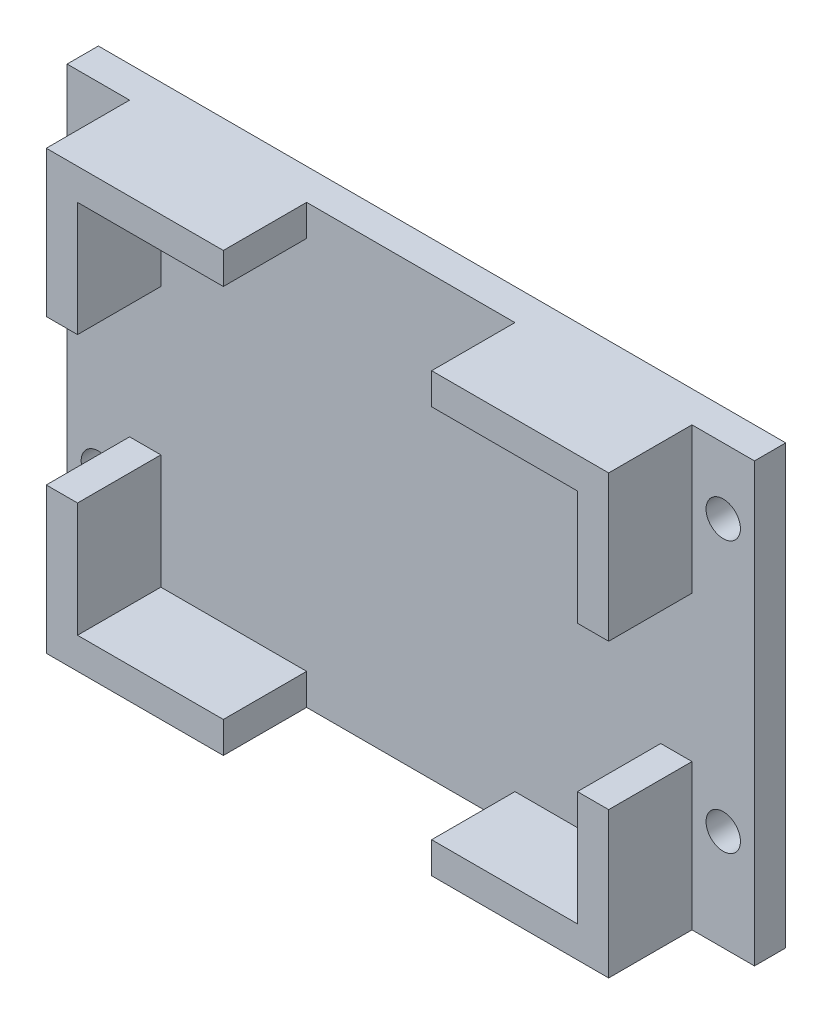
ISO-10303-21;
HEADER;
FILE_DESCRIPTION(('STEP AP214'),'2;1');
FILE_NAME('part.step','',(''),(''),'','','');
FILE_SCHEMA(('AUTOMOTIVE_DESIGN { 1 0 10303 214 1 1 1 1 }'));
ENDSEC;
DATA;
#1=APPLICATION_CONTEXT('core data for automotive mechanical design processes');
#2=APPLICATION_PROTOCOL_DEFINITION('international standard','automotive_design',2000,#1);
#3=PRODUCT_CONTEXT('',#1,'mechanical');
#4=PRODUCT('Part','Part','',(#3));
#5=PRODUCT_RELATED_PRODUCT_CATEGORY('part','',(#4));
#6=PRODUCT_DEFINITION_FORMATION('','',#4);
#7=PRODUCT_DEFINITION_CONTEXT('part definition',#1,'design');
#8=PRODUCT_DEFINITION('design','',#6,#7);
#9=PRODUCT_DEFINITION_SHAPE('','',#8);
#10=(LENGTH_UNIT() NAMED_UNIT(*) SI_UNIT(.MILLI.,.METRE.));
#11=(NAMED_UNIT(*) PLANE_ANGLE_UNIT() SI_UNIT($,.RADIAN.));
#12=(NAMED_UNIT(*) SI_UNIT($,.STERADIAN.) SOLID_ANGLE_UNIT());
#13=UNCERTAINTY_MEASURE_WITH_UNIT(LENGTH_MEASURE(1.E-05),#10,'distance_accuracy_value','');
#14=(GEOMETRIC_REPRESENTATION_CONTEXT(3) GLOBAL_UNCERTAINTY_ASSIGNED_CONTEXT((#13)) GLOBAL_UNIT_ASSIGNED_CONTEXT((#10,
#11,#12)) REPRESENTATION_CONTEXT('',''));
#15=CARTESIAN_POINT('',(0.,0.,0.));
#16=DIRECTION('',(0.,0.,1.));
#17=DIRECTION('',(1.,0.,0.));
#18=AXIS2_PLACEMENT_3D('',#15,#16,#17);
#19=CARTESIAN_POINT('',(0.,0.,11.));
#20=DIRECTION('',(0.,0.,1.));
#21=DIRECTION('',(1.,0.,0.));
#22=AXIS2_PLACEMENT_3D('',#19,#20,#21);
#23=PLANE('',#22);
#24=DIRECTION('',(-1.,0.,0.));
#25=VECTOR('',#24,1.);
#26=CARTESIAN_POINT('',(33.,-6.99999999999999,11.));
#27=LINE('',#26,#25);
#28=CARTESIAN_POINT('',(-24.,-7.,11.));
#29=VERTEX_POINT('',#28);
#30=CARTESIAN_POINT('',(-27.,-7.,11.));
#31=VERTEX_POINT('',#30);
#32=EDGE_CURVE('E598',#29,#31,#27,.T.);
#33=ORIENTED_EDGE('',*,*,#32,.T.);
#34=DIRECTION('',(0.,-1.,0.));
#35=VECTOR('',#34,1.);
#36=CARTESIAN_POINT('',(-27.,21.,11.));
#37=LINE('',#36,#35);
#38=CARTESIAN_POINT('',(-27.,-21.,11.));
#39=VERTEX_POINT('',#38);
#40=EDGE_CURVE('E243',#31,#39,#37,.T.);
#41=ORIENTED_EDGE('',*,*,#40,.T.);
#42=DIRECTION('',(1.,0.,0.));
#43=VECTOR('',#42,1.);
#44=CARTESIAN_POINT('',(-27.,-21.,11.));
#45=LINE('',#44,#43);
#46=CARTESIAN_POINT('',(-10.,-21.,11.));
#47=VERTEX_POINT('',#46);
#48=EDGE_CURVE('E245',#39,#47,#45,.T.);
#49=ORIENTED_EDGE('',*,*,#48,.T.);
#50=DIRECTION('',(0.,1.,0.));
#51=VECTOR('',#50,1.);
#52=CARTESIAN_POINT('',(-10.,-119.75,11.));
#53=LINE('',#52,#51);
#54=CARTESIAN_POINT('',(-10.,-18.,11.));
#55=VERTEX_POINT('',#54);
#56=EDGE_CURVE('E449',#47,#55,#53,.T.);
#57=ORIENTED_EDGE('',*,*,#56,.T.);
#58=DIRECTION('',(1.,0.,0.));
#59=VECTOR('',#58,1.);
#60=CARTESIAN_POINT('',(-24.,-18.,11.));
#61=LINE('',#60,#59);
#62=CARTESIAN_POINT('',(-24.,-18.,11.));
#63=VERTEX_POINT('',#62);
#64=EDGE_CURVE('E339',#63,#55,#61,.T.);
#65=ORIENTED_EDGE('',*,*,#64,.F.);
#66=DIRECTION('',(0.,-1.,0.));
#67=VECTOR('',#66,1.);
#68=CARTESIAN_POINT('',(-24.,18.,11.));
#69=LINE('',#68,#67);
#70=EDGE_CURVE('E473',#29,#63,#69,.T.);
#71=ORIENTED_EDGE('',*,*,#70,.F.);
#72=EDGE_LOOP('',(#33,#41,#49,#57,#65,#71));
#73=FACE_BOUND('',#72,.T.);
#74=ADVANCED_FACE('F36',(#73),#23,.T.);
#75=CARTESIAN_POINT('',(27.,-7.,11.));
#76=VERTEX_POINT('',#75);
#77=CARTESIAN_POINT('',(24.,-7.,11.));
#78=VERTEX_POINT('',#77);
#79=EDGE_CURVE('E427',#76,#78,#27,.T.);
#80=ORIENTED_EDGE('',*,*,#79,.T.);
#81=DIRECTION('',(0.,1.,0.));
#82=VECTOR('',#81,1.);
#83=CARTESIAN_POINT('',(24.,18.,11.));
#84=LINE('',#83,#82);
#85=CARTESIAN_POINT('',(24.,-18.,11.));
#86=VERTEX_POINT('',#85);
#87=EDGE_CURVE('E355',#86,#78,#84,.T.);
#88=ORIENTED_EDGE('',*,*,#87,.F.);
#89=CARTESIAN_POINT('',(10.,-18.,11.));
#90=VERTEX_POINT('',#89);
#91=EDGE_CURVE('E476',#90,#86,#61,.T.);
#92=ORIENTED_EDGE('',*,*,#91,.F.);
#93=DIRECTION('',(0.,1.,0.));
#94=VECTOR('',#93,1.);
#95=CARTESIAN_POINT('',(10.,-119.75,11.));
#96=LINE('',#95,#94);
#97=CARTESIAN_POINT('',(10.,-21.,11.));
#98=VERTEX_POINT('',#97);
#99=EDGE_CURVE('E440',#98,#90,#96,.T.);
#100=ORIENTED_EDGE('',*,*,#99,.F.);
#101=CARTESIAN_POINT('',(27.,-21.,11.));
#102=VERTEX_POINT('',#101);
#103=EDGE_CURVE('E242',#98,#102,#45,.T.);
#104=ORIENTED_EDGE('',*,*,#103,.T.);
#105=DIRECTION('',(0.,1.,0.));
#106=VECTOR('',#105,1.);
#107=CARTESIAN_POINT('',(27.,21.,11.));
#108=LINE('',#107,#106);
#109=EDGE_CURVE('E371',#102,#76,#108,.T.);
#110=ORIENTED_EDGE('',*,*,#109,.T.);
#111=EDGE_LOOP('',(#80,#88,#92,#100,#104,#110));
#112=FACE_BOUND('',#111,.T.);
#113=ADVANCED_FACE('F507',(#112),#23,.T.);
#114=CARTESIAN_POINT('',(27.,21.,11.));
#115=DIRECTION('',(-1.,0.,0.));
#116=DIRECTION('',(0.,-1.,0.));
#117=AXIS2_PLACEMENT_3D('',#114,#115,#116);
#118=PLANE('',#117);
#119=DIRECTION('',(0.,1.,0.));
#120=VECTOR('',#119,1.);
#121=CARTESIAN_POINT('',(27.,21.,3.));
#122=LINE('',#121,#120);
#123=CARTESIAN_POINT('',(27.,-21.,3.));
#124=VERTEX_POINT('',#123);
#125=CARTESIAN_POINT('',(27.,-6.99999999999999,3.));
#126=VERTEX_POINT('',#125);
#127=EDGE_CURVE('E253',#124,#126,#122,.T.);
#128=ORIENTED_EDGE('',*,*,#127,.T.);
#129=DIRECTION('',(0.,0.,1.));
#130=VECTOR('',#129,1.);
#131=CARTESIAN_POINT('',(27.,-6.99999999999999,11.));
#132=LINE('',#131,#130);
#133=EDGE_CURVE('E434',#126,#76,#132,.T.);
#134=ORIENTED_EDGE('',*,*,#133,.T.);
#135=ORIENTED_EDGE('',*,*,#109,.F.);
#136=DIRECTION('',(0.,0.,-1.));
#137=VECTOR('',#136,1.);
#138=CARTESIAN_POINT('',(27.,-21.,11.));
#139=LINE('',#138,#137);
#140=EDGE_CURVE('E252',#102,#124,#139,.T.);
#141=ORIENTED_EDGE('',*,*,#140,.T.);
#142=EDGE_LOOP('',(#128,#134,#135,#141));
#143=FACE_BOUND('',#142,.T.);
#144=ADVANCED_FACE('F513',(#143),#118,.F.);
#145=CARTESIAN_POINT('',(-27.,21.,11.));
#146=DIRECTION('',(1.,0.,0.));
#147=DIRECTION('',(0.,1.,0.));
#148=AXIS2_PLACEMENT_3D('',#145,#146,#147);
#149=PLANE('',#148);
#150=ORIENTED_EDGE('',*,*,#40,.F.);
#151=DIRECTION('',(0.,0.,1.));
#152=VECTOR('',#151,1.);
#153=CARTESIAN_POINT('',(-27.,-7.,3.));
#154=LINE('',#153,#152);
#155=CARTESIAN_POINT('',(-27.,-7.,3.));
#156=VERTEX_POINT('',#155);
#157=EDGE_CURVE('E228',#156,#31,#154,.T.);
#158=ORIENTED_EDGE('',*,*,#157,.F.);
#159=DIRECTION('',(0.,-1.,0.));
#160=VECTOR('',#159,1.);
#161=CARTESIAN_POINT('',(-27.,21.,3.));
#162=LINE('',#161,#160);
#163=CARTESIAN_POINT('',(-27.,-21.,3.));
#164=VERTEX_POINT('',#163);
#165=EDGE_CURVE('E256',#156,#164,#162,.T.);
#166=ORIENTED_EDGE('',*,*,#165,.T.);
#167=DIRECTION('',(0.,0.,-1.));
#168=VECTOR('',#167,1.);
#169=CARTESIAN_POINT('',(-27.,-21.,11.));
#170=LINE('',#169,#168);
#171=EDGE_CURVE('E262',#39,#164,#170,.T.);
#172=ORIENTED_EDGE('',*,*,#171,.F.);
#173=EDGE_LOOP('',(#150,#158,#166,#172));
#174=FACE_BOUND('',#173,.T.);
#175=ADVANCED_FACE('F578',(#174),#149,.F.);
#176=CARTESIAN_POINT('',(24.,18.,11.));
#177=DIRECTION('',(-1.,0.,0.));
#178=DIRECTION('',(0.,0.,1.));
#179=AXIS2_PLACEMENT_3D('',#176,#177,#178);
#180=PLANE('',#179);
#181=DIRECTION('',(0.,0.,1.));
#182=VECTOR('',#181,1.);
#183=CARTESIAN_POINT('',(24.,-6.99999999999999,11.));
#184=LINE('',#183,#182);
#185=CARTESIAN_POINT('',(24.,-7.,3.));
#186=VERTEX_POINT('',#185);
#187=EDGE_CURVE('E432',#186,#78,#184,.T.);
#188=ORIENTED_EDGE('',*,*,#187,.F.);
#189=DIRECTION('',(0.,1.,0.));
#190=VECTOR('',#189,1.);
#191=CARTESIAN_POINT('',(24.,18.,3.));
#192=LINE('',#191,#190);
#193=CARTESIAN_POINT('',(24.,-18.,3.));
#194=VERTEX_POINT('',#193);
#195=EDGE_CURVE('E478',#194,#186,#192,.T.);
#196=ORIENTED_EDGE('',*,*,#195,.F.);
#197=DIRECTION('',(0.,0.,-1.));
#198=VECTOR('',#197,1.);
#199=CARTESIAN_POINT('',(24.,-18.,11.));
#200=LINE('',#199,#198);
#201=EDGE_CURVE('E361',#86,#194,#200,.T.);
#202=ORIENTED_EDGE('',*,*,#201,.F.);
#203=ORIENTED_EDGE('',*,*,#87,.T.);
#204=EDGE_LOOP('',(#188,#196,#202,#203));
#205=FACE_BOUND('',#204,.T.);
#206=ADVANCED_FACE('F583',(#205),#180,.T.);
#207=CARTESIAN_POINT('',(-24.,18.,11.));
#208=DIRECTION('',(1.,0.,0.));
#209=DIRECTION('',(0.,0.,-1.));
#210=AXIS2_PLACEMENT_3D('',#207,#208,#209);
#211=PLANE('',#210);
#212=DIRECTION('',(0.,0.,-1.));
#213=VECTOR('',#212,1.);
#214=CARTESIAN_POINT('',(-24.,-7.,11.));
#215=LINE('',#214,#213);
#216=CARTESIAN_POINT('',(-24.,-7.,3.));
#217=VERTEX_POINT('',#216);
#218=EDGE_CURVE('E430',#29,#217,#215,.T.);
#219=ORIENTED_EDGE('',*,*,#218,.F.);
#220=ORIENTED_EDGE('',*,*,#70,.T.);
#221=DIRECTION('',(0.,0.,-1.));
#222=VECTOR('',#221,1.);
#223=CARTESIAN_POINT('',(-24.,-18.,11.));
#224=LINE('',#223,#222);
#225=CARTESIAN_POINT('',(-24.,-18.,3.));
#226=VERTEX_POINT('',#225);
#227=EDGE_CURVE('E364',#63,#226,#224,.T.);
#228=ORIENTED_EDGE('',*,*,#227,.T.);
#229=DIRECTION('',(0.,-1.,0.));
#230=VECTOR('',#229,1.);
#231=CARTESIAN_POINT('',(-24.,18.,3.));
#232=LINE('',#231,#230);
#233=EDGE_CURVE('E350',#217,#226,#232,.T.);
#234=ORIENTED_EDGE('',*,*,#233,.F.);
#235=EDGE_LOOP('',(#219,#220,#228,#234));
#236=FACE_BOUND('',#235,.T.);
#237=ADVANCED_FACE('F536',(#236),#211,.T.);
#238=CARTESIAN_POINT('',(0.,-21.,3.));
#239=DIRECTION('',(0.,-1.,0.));
#240=DIRECTION('',(0.,0.,-1.));
#241=AXIS2_PLACEMENT_3D('',#238,#239,#240);
#242=PLANE('',#241);
#243=DIRECTION('',(-1.,0.,0.));
#244=VECTOR('',#243,1.);
#245=CARTESIAN_POINT('',(0.,-21.,3.));
#246=LINE('',#245,#244);
#247=CARTESIAN_POINT('',(10.,-21.,3.));
#248=VERTEX_POINT('',#247);
#249=CARTESIAN_POINT('',(-10.,-21.,3.));
#250=VERTEX_POINT('',#249);
#251=EDGE_CURVE('E465',#248,#250,#246,.T.);
#252=ORIENTED_EDGE('',*,*,#251,.T.);
#253=DIRECTION('',(0.,0.,1.));
#254=VECTOR('',#253,1.);
#255=CARTESIAN_POINT('',(-10.,-21.,3.));
#256=LINE('',#255,#254);
#257=EDGE_CURVE('E462',#250,#47,#256,.T.);
#258=ORIENTED_EDGE('',*,*,#257,.T.);
#259=ORIENTED_EDGE('',*,*,#48,.F.);
#260=ORIENTED_EDGE('',*,*,#171,.T.);
#261=DIRECTION('',(-1.,0.,0.));
#262=VECTOR('',#261,1.);
#263=CARTESIAN_POINT('',(0.,-21.,3.));
#264=LINE('',#263,#262);
#265=CARTESIAN_POINT('',(-33.,-21.,3.));
#266=VERTEX_POINT('',#265);
#267=EDGE_CURVE('E278',#164,#266,#264,.T.);
#268=ORIENTED_EDGE('',*,*,#267,.T.);
#269=DIRECTION('',(0.,0.,-1.));
#270=VECTOR('',#269,1.);
#271=CARTESIAN_POINT('',(-33.,-21.,3.));
#272=LINE('',#271,#270);
#273=CARTESIAN_POINT('',(-33.,-21.,0.));
#274=VERTEX_POINT('',#273);
#275=EDGE_CURVE('E297',#266,#274,#272,.T.);
#276=ORIENTED_EDGE('',*,*,#275,.T.);
#277=DIRECTION('',(-1.,0.,0.));
#278=VECTOR('',#277,1.);
#279=CARTESIAN_POINT('',(0.,-21.,0.));
#280=LINE('',#279,#278);
#281=CARTESIAN_POINT('',(33.,-21.,0.));
#282=VERTEX_POINT('',#281);
#283=EDGE_CURVE('E303',#282,#274,#280,.T.);
#284=ORIENTED_EDGE('',*,*,#283,.F.);
#285=DIRECTION('',(0.,0.,-1.));
#286=VECTOR('',#285,1.);
#287=CARTESIAN_POINT('',(33.,-21.,3.));
#288=LINE('',#287,#286);
#289=CARTESIAN_POINT('',(33.,-21.,3.));
#290=VERTEX_POINT('',#289);
#291=EDGE_CURVE('E326',#290,#282,#288,.T.);
#292=ORIENTED_EDGE('',*,*,#291,.F.);
#293=EDGE_CURVE('E279',#290,#124,#264,.T.);
#294=ORIENTED_EDGE('',*,*,#293,.T.);
#295=ORIENTED_EDGE('',*,*,#140,.F.);
#296=ORIENTED_EDGE('',*,*,#103,.F.);
#297=DIRECTION('',(0.,0.,-1.));
#298=VECTOR('',#297,1.);
#299=CARTESIAN_POINT('',(10.,-21.,3.));
#300=LINE('',#299,#298);
#301=EDGE_CURVE('E454',#98,#248,#300,.T.);
#302=ORIENTED_EDGE('',*,*,#301,.T.);
#303=EDGE_LOOP('',(#252,#258,#259,#260,#268,#276,#284,#292,#294,#295,#296,#302));
#304=FACE_BOUND('',#303,.T.);
#305=ADVANCED_FACE('F410',(#304),#242,.T.);
#306=CARTESIAN_POINT('',(0.,21.,3.));
#307=DIRECTION('',(0.,-1.,0.));
#308=DIRECTION('',(0.,0.,-1.));
#309=AXIS2_PLACEMENT_3D('',#306,#307,#308);
#310=PLANE('',#309);
#311=DIRECTION('',(0.,0.,1.));
#312=VECTOR('',#311,1.);
#313=CARTESIAN_POINT('',(-10.,21.,3.));
#314=LINE('',#313,#312);
#315=CARTESIAN_POINT('',(-10.,21.,3.));
#316=VERTEX_POINT('',#315);
#317=CARTESIAN_POINT('',(-10.,21.,11.));
#318=VERTEX_POINT('',#317);
#319=EDGE_CURVE('E460',#316,#318,#314,.T.);
#320=ORIENTED_EDGE('',*,*,#319,.F.);
#321=DIRECTION('',(-1.,0.,0.));
#322=VECTOR('',#321,1.);
#323=CARTESIAN_POINT('',(0.,21.,3.));
#324=LINE('',#323,#322);
#325=CARTESIAN_POINT('',(10.,21.,3.));
#326=VERTEX_POINT('',#325);
#327=EDGE_CURVE('E11',#326,#316,#324,.T.);
#328=ORIENTED_EDGE('',*,*,#327,.F.);
#329=DIRECTION('',(0.,0.,-1.));
#330=VECTOR('',#329,1.);
#331=CARTESIAN_POINT('',(10.,21.,3.));
#332=LINE('',#331,#330);
#333=CARTESIAN_POINT('',(10.,21.,11.));
#334=VERTEX_POINT('',#333);
#335=EDGE_CURVE('E392',#334,#326,#332,.T.);
#336=ORIENTED_EDGE('',*,*,#335,.F.);
#337=DIRECTION('',(-1.,0.,0.));
#338=VECTOR('',#337,1.);
#339=CARTESIAN_POINT('',(-27.,21.,11.));
#340=LINE('',#339,#338);
#341=CARTESIAN_POINT('',(27.,21.,11.));
#342=VERTEX_POINT('',#341);
#343=EDGE_CURVE('E247',#342,#334,#340,.T.);
#344=ORIENTED_EDGE('',*,*,#343,.F.);
#345=DIRECTION('',(0.,0.,-1.));
#346=VECTOR('',#345,1.);
#347=CARTESIAN_POINT('',(27.,21.,11.));
#348=LINE('',#347,#346);
#349=CARTESIAN_POINT('',(27.,21.,3.));
#350=VERTEX_POINT('',#349);
#351=EDGE_CURVE('E267',#342,#350,#348,.T.);
#352=ORIENTED_EDGE('',*,*,#351,.T.);
#353=DIRECTION('',(-1.,0.,0.));
#354=VECTOR('',#353,1.);
#355=CARTESIAN_POINT('',(0.,21.,3.));
#356=LINE('',#355,#354);
#357=CARTESIAN_POINT('',(33.,21.,3.));
#358=VERTEX_POINT('',#357);
#359=EDGE_CURVE('E285',#358,#350,#356,.T.);
#360=ORIENTED_EDGE('',*,*,#359,.F.);
#361=DIRECTION('',(0.,0.,-1.));
#362=VECTOR('',#361,1.);
#363=CARTESIAN_POINT('',(33.,21.,3.));
#364=LINE('',#363,#362);
#365=CARTESIAN_POINT('',(33.,21.,0.));
#366=VERTEX_POINT('',#365);
#367=EDGE_CURVE('E324',#358,#366,#364,.T.);
#368=ORIENTED_EDGE('',*,*,#367,.T.);
#369=DIRECTION('',(-1.,0.,0.));
#370=VECTOR('',#369,1.);
#371=CARTESIAN_POINT('',(0.,21.,0.));
#372=LINE('',#371,#370);
#373=CARTESIAN_POINT('',(-33.,21.,0.));
#374=VERTEX_POINT('',#373);
#375=EDGE_CURVE('E309',#366,#374,#372,.T.);
#376=ORIENTED_EDGE('',*,*,#375,.T.);
#377=DIRECTION('',(0.,0.,-1.));
#378=VECTOR('',#377,1.);
#379=CARTESIAN_POINT('',(-33.,21.,3.));
#380=LINE('',#379,#378);
#381=CARTESIAN_POINT('',(-33.,21.,3.));
#382=VERTEX_POINT('',#381);
#383=EDGE_CURVE('E321',#382,#374,#380,.T.);
#384=ORIENTED_EDGE('',*,*,#383,.F.);
#385=CARTESIAN_POINT('',(-27.,21.,3.));
#386=VERTEX_POINT('',#385);
#387=EDGE_CURVE('E284',#386,#382,#356,.T.);
#388=ORIENTED_EDGE('',*,*,#387,.F.);
#389=DIRECTION('',(0.,0.,-1.));
#390=VECTOR('',#389,1.);
#391=CARTESIAN_POINT('',(-27.,21.,11.));
#392=LINE('',#391,#390);
#393=CARTESIAN_POINT('',(-27.,21.,11.));
#394=VERTEX_POINT('',#393);
#395=EDGE_CURVE('E265',#394,#386,#392,.T.);
#396=ORIENTED_EDGE('',*,*,#395,.F.);
#397=EDGE_CURVE('E240',#318,#394,#340,.T.);
#398=ORIENTED_EDGE('',*,*,#397,.F.);
#399=EDGE_LOOP('',(#320,#328,#336,#344,#352,#360,#368,#376,#384,#388,#396,#398));
#400=FACE_BOUND('',#399,.T.);
#401=ADVANCED_FACE('F389',(#400),#310,.F.);
#402=DIRECTION('',(-1.,0.,0.));
#403=VECTOR('',#402,1.);
#404=CARTESIAN_POINT('',(33.,7.00000000000001,11.));
#405=LINE('',#404,#403);
#406=CARTESIAN_POINT('',(-24.,7.,11.));
#407=VERTEX_POINT('',#406);
#408=CARTESIAN_POINT('',(-27.,7.,11.));
#409=VERTEX_POINT('',#408);
#410=EDGE_CURVE('E218',#407,#409,#405,.T.);
#411=ORIENTED_EDGE('',*,*,#410,.F.);
#412=CARTESIAN_POINT('',(-24.,18.,11.));
#413=VERTEX_POINT('',#412);
#414=EDGE_CURVE('E474',#413,#407,#69,.T.);
#415=ORIENTED_EDGE('',*,*,#414,.F.);
#416=DIRECTION('',(-1.,0.,0.));
#417=VECTOR('',#416,1.);
#418=CARTESIAN_POINT('',(-24.,18.,11.));
#419=LINE('',#418,#417);
#420=CARTESIAN_POINT('',(-10.,17.9999999999999,11.));
#421=VERTEX_POINT('',#420);
#422=EDGE_CURVE('E469',#421,#413,#419,.T.);
#423=ORIENTED_EDGE('',*,*,#422,.F.);
#424=EDGE_CURVE('E447',#421,#318,#53,.T.);
#425=ORIENTED_EDGE('',*,*,#424,.T.);
#426=ORIENTED_EDGE('',*,*,#397,.T.);
#427=EDGE_CURVE('E234',#394,#409,#37,.T.);
#428=ORIENTED_EDGE('',*,*,#427,.T.);
#429=EDGE_LOOP('',(#411,#415,#423,#425,#426,#428));
#430=FACE_BOUND('',#429,.T.);
#431=ADVANCED_FACE('F237',(#430),#23,.T.);
#432=CARTESIAN_POINT('',(-24.,18.,11.));
#433=DIRECTION('',(0.,-1.,0.));
#434=DIRECTION('',(0.,0.,-1.));
#435=AXIS2_PLACEMENT_3D('',#432,#433,#434);
#436=PLANE('',#435);
#437=DIRECTION('',(-1.,0.,0.));
#438=VECTOR('',#437,1.);
#439=CARTESIAN_POINT('',(-24.,18.,3.));
#440=LINE('',#439,#438);
#441=CARTESIAN_POINT('',(-10.,17.9999999999999,3.));
#442=VERTEX_POINT('',#441);
#443=CARTESIAN_POINT('',(-24.,18.,3.));
#444=VERTEX_POINT('',#443);
#445=EDGE_CURVE('E480',#442,#444,#440,.T.);
#446=ORIENTED_EDGE('',*,*,#445,.F.);
#447=DIRECTION('',(0.,0.,1.));
#448=VECTOR('',#447,1.);
#449=CARTESIAN_POINT('',(-10.,18.,11.));
#450=LINE('',#449,#448);
#451=EDGE_CURVE('E457',#442,#421,#450,.T.);
#452=ORIENTED_EDGE('',*,*,#451,.T.);
#453=ORIENTED_EDGE('',*,*,#422,.T.);
#454=DIRECTION('',(0.,0.,-1.));
#455=VECTOR('',#454,1.);
#456=CARTESIAN_POINT('',(-24.,18.,11.));
#457=LINE('',#456,#455);
#458=EDGE_CURVE('E366',#413,#444,#457,.T.);
#459=ORIENTED_EDGE('',*,*,#458,.T.);
#460=EDGE_LOOP('',(#446,#452,#453,#459));
#461=FACE_BOUND('',#460,.T.);
#462=ADVANCED_FACE('F488',(#461),#436,.T.);
#463=CARTESIAN_POINT('',(24.,18.,11.));
#464=VERTEX_POINT('',#463);
#465=CARTESIAN_POINT('',(10.,17.9999999999999,11.));
#466=VERTEX_POINT('',#465);
#467=EDGE_CURVE('E470',#464,#466,#419,.T.);
#468=ORIENTED_EDGE('',*,*,#467,.T.);
#469=DIRECTION('',(0.,0.,-1.));
#470=VECTOR('',#469,1.);
#471=CARTESIAN_POINT('',(10.,18.,11.));
#472=LINE('',#471,#470);
#473=CARTESIAN_POINT('',(10.,18.,3.));
#474=VERTEX_POINT('',#473);
#475=EDGE_CURVE('E450',#466,#474,#472,.T.);
#476=ORIENTED_EDGE('',*,*,#475,.T.);
#477=CARTESIAN_POINT('',(24.,18.,3.));
#478=VERTEX_POINT('',#477);
#479=EDGE_CURVE('E481',#478,#474,#440,.T.);
#480=ORIENTED_EDGE('',*,*,#479,.F.);
#481=DIRECTION('',(0.,0.,-1.));
#482=VECTOR('',#481,1.);
#483=CARTESIAN_POINT('',(24.,18.,11.));
#484=LINE('',#483,#482);
#485=EDGE_CURVE('E369',#464,#478,#484,.T.);
#486=ORIENTED_EDGE('',*,*,#485,.F.);
#487=EDGE_LOOP('',(#468,#476,#480,#486));
#488=FACE_BOUND('',#487,.T.);
#489=ADVANCED_FACE('F530',(#488),#436,.T.);
#490=CARTESIAN_POINT('',(-24.,-18.,11.));
#491=DIRECTION('',(0.,1.,0.));
#492=DIRECTION('',(0.,0.,1.));
#493=AXIS2_PLACEMENT_3D('',#490,#491,#492);
#494=PLANE('',#493);
#495=ORIENTED_EDGE('',*,*,#64,.T.);
#496=DIRECTION('',(0.,0.,-1.));
#497=VECTOR('',#496,1.);
#498=CARTESIAN_POINT('',(-10.,-18.,11.));
#499=LINE('',#498,#497);
#500=CARTESIAN_POINT('',(-10.,-18.,3.));
#501=VERTEX_POINT('',#500);
#502=EDGE_CURVE('E44',#55,#501,#499,.T.);
#503=ORIENTED_EDGE('',*,*,#502,.T.);
#504=DIRECTION('',(1.,0.,0.));
#505=VECTOR('',#504,1.);
#506=CARTESIAN_POINT('',(-24.,-18.,3.));
#507=LINE('',#506,#505);
#508=EDGE_CURVE('E337',#226,#501,#507,.T.);
#509=ORIENTED_EDGE('',*,*,#508,.F.);
#510=ORIENTED_EDGE('',*,*,#227,.F.);
#511=EDGE_LOOP('',(#495,#503,#509,#510));
#512=FACE_BOUND('',#511,.T.);
#513=ADVANCED_FACE('F335',(#512),#494,.T.);
#514=CARTESIAN_POINT('',(10.,-18.,3.));
#515=VERTEX_POINT('',#514);
#516=EDGE_CURVE('E353',#515,#194,#507,.T.);
#517=ORIENTED_EDGE('',*,*,#516,.F.);
#518=DIRECTION('',(0.,0.,1.));
#519=VECTOR('',#518,1.);
#520=CARTESIAN_POINT('',(10.,-18.,11.));
#521=LINE('',#520,#519);
#522=EDGE_CURVE('E328',#515,#90,#521,.T.);
#523=ORIENTED_EDGE('',*,*,#522,.T.);
#524=ORIENTED_EDGE('',*,*,#91,.T.);
#525=ORIENTED_EDGE('',*,*,#201,.T.);
#526=EDGE_LOOP('',(#517,#523,#524,#525));
#527=FACE_BOUND('',#526,.T.);
#528=ADVANCED_FACE('F543',(#527),#494,.T.);
#529=CARTESIAN_POINT('',(33.,0.,3.));
#530=DIRECTION('',(1.,0.,0.));
#531=DIRECTION('',(0.,0.,-1.));
#532=AXIS2_PLACEMENT_3D('',#529,#530,#531);
#533=PLANE('',#532);
#534=DIRECTION('',(0.,-1.,0.));
#535=VECTOR('',#534,1.);
#536=CARTESIAN_POINT('',(33.,0.,0.));
#537=LINE('',#536,#535);
#538=EDGE_CURVE('E306',#366,#282,#537,.T.);
#539=ORIENTED_EDGE('',*,*,#538,.F.);
#540=ORIENTED_EDGE('',*,*,#367,.F.);
#541=DIRECTION('',(0.,-1.,0.));
#542=VECTOR('',#541,1.);
#543=CARTESIAN_POINT('',(33.,0.,3.));
#544=LINE('',#543,#542);
#545=EDGE_CURVE('E282',#358,#290,#544,.T.);
#546=ORIENTED_EDGE('',*,*,#545,.T.);
#547=ORIENTED_EDGE('',*,*,#291,.T.);
#548=EDGE_LOOP('',(#539,#540,#546,#547));
#549=FACE_BOUND('',#548,.T.);
#550=ADVANCED_FACE('F406',(#549),#533,.T.);
#551=CARTESIAN_POINT('',(30.,-11.3167688964495,3.));
#552=DIRECTION('',(0.,0.,-1.));
#553=DIRECTION('',(-1.,0.,0.));
#554=AXIS2_PLACEMENT_3D('',#551,#552,#553);
#555=CYLINDRICAL_SURFACE('',#554,1.65);
#556=CARTESIAN_POINT('',(30.,-11.3167688964495,3.));
#557=DIRECTION('',(0.,0.,1.));
#558=DIRECTION('',(1.,0.,0.));
#559=AXIS2_PLACEMENT_3D('',#556,#557,#558);
#560=CIRCLE('',#559,1.65);
#561=CARTESIAN_POINT('',(31.65,-11.3167688964495,3.));
#562=VERTEX_POINT('',#561);
#563=EDGE_CURVE('E291',#562,#562,#560,.F.);
#564=ORIENTED_EDGE('',*,*,#563,.F.);
#565=EDGE_LOOP('',(#564));
#566=FACE_BOUND('',#565,.T.);
#567=CARTESIAN_POINT('',(30.,-11.3167688964495,0.));
#568=DIRECTION('',(0.,0.,1.));
#569=DIRECTION('',(1.,0.,0.));
#570=AXIS2_PLACEMENT_3D('',#567,#568,#569);
#571=CIRCLE('',#570,1.65);
#572=CARTESIAN_POINT('',(31.65,-11.3167688964495,0.));
#573=VERTEX_POINT('',#572);
#574=EDGE_CURVE('E315',#573,#573,#571,.F.);
#575=ORIENTED_EDGE('',*,*,#574,.T.);
#576=EDGE_LOOP('',(#575));
#577=FACE_BOUND('',#576,.T.);
#578=ADVANCED_FACE('F542',(#566,#577),#555,.F.);
#579=CARTESIAN_POINT('',(-33.,0.,3.));
#580=DIRECTION('',(1.,0.,0.));
#581=DIRECTION('',(0.,0.,-1.));
#582=AXIS2_PLACEMENT_3D('',#579,#580,#581);
#583=PLANE('',#582);
#584=DIRECTION('',(0.,-1.,0.));
#585=VECTOR('',#584,1.);
#586=CARTESIAN_POINT('',(-33.,0.,0.));
#587=LINE('',#586,#585);
#588=EDGE_CURVE('E312',#374,#274,#587,.T.);
#589=ORIENTED_EDGE('',*,*,#588,.T.);
#590=ORIENTED_EDGE('',*,*,#275,.F.);
#591=DIRECTION('',(0.,-1.,0.));
#592=VECTOR('',#591,1.);
#593=CARTESIAN_POINT('',(-33.,0.,3.));
#594=LINE('',#593,#592);
#595=EDGE_CURVE('E288',#382,#266,#594,.T.);
#596=ORIENTED_EDGE('',*,*,#595,.F.);
#597=ORIENTED_EDGE('',*,*,#383,.T.);
#598=EDGE_LOOP('',(#589,#590,#596,#597));
#599=FACE_BOUND('',#598,.T.);
#600=ADVANCED_FACE('F415',(#599),#583,.F.);
#601=CARTESIAN_POINT('',(-30.,14.6832311035505,3.));
#602=DIRECTION('',(0.,0.,-1.));
#603=DIRECTION('',(-1.,0.,0.));
#604=AXIS2_PLACEMENT_3D('',#601,#602,#603);
#605=CYLINDRICAL_SURFACE('',#604,1.65);
#606=CARTESIAN_POINT('',(-30.,14.6832311035505,3.));
#607=DIRECTION('',(0.,0.,1.));
#608=DIRECTION('',(1.,0.,0.));
#609=AXIS2_PLACEMENT_3D('',#606,#607,#608);
#610=CIRCLE('',#609,1.65);
#611=CARTESIAN_POINT('',(-28.35,14.6832311035505,3.));
#612=VERTEX_POINT('',#611);
#613=EDGE_CURVE('E274',#612,#612,#610,.T.);
#614=ORIENTED_EDGE('',*,*,#613,.T.);
#615=EDGE_LOOP('',(#614));
#616=FACE_BOUND('',#615,.T.);
#617=CARTESIAN_POINT('',(-30.,14.6832311035505,0.));
#618=DIRECTION('',(0.,0.,1.));
#619=DIRECTION('',(1.,0.,0.));
#620=AXIS2_PLACEMENT_3D('',#617,#618,#619);
#621=CIRCLE('',#620,1.65);
#622=CARTESIAN_POINT('',(-28.35,14.6832311035505,0.));
#623=VERTEX_POINT('',#622);
#624=EDGE_CURVE('E300',#623,#623,#621,.T.);
#625=ORIENTED_EDGE('',*,*,#624,.F.);
#626=EDGE_LOOP('',(#625));
#627=FACE_BOUND('',#626,.T.);
#628=ADVANCED_FACE('F544',(#616,#627),#605,.F.);
#629=CARTESIAN_POINT('',(-30.,-11.3167688964495,3.));
#630=DIRECTION('',(0.,0.,-1.));
#631=DIRECTION('',(-1.,0.,0.));
#632=AXIS2_PLACEMENT_3D('',#629,#630,#631);
#633=CYLINDRICAL_SURFACE('',#632,1.65);
#634=CARTESIAN_POINT('',(-30.,-11.3167688964495,3.));
#635=DIRECTION('',(0.,0.,1.));
#636=DIRECTION('',(1.,0.,0.));
#637=AXIS2_PLACEMENT_3D('',#634,#635,#636);
#638=CIRCLE('',#637,1.65);
#639=CARTESIAN_POINT('',(-28.35,-11.3167688964495,3.));
#640=VERTEX_POINT('',#639);
#641=EDGE_CURVE('E271',#640,#640,#638,.T.);
#642=ORIENTED_EDGE('',*,*,#641,.T.);
#643=EDGE_LOOP('',(#642));
#644=FACE_BOUND('',#643,.T.);
#645=CARTESIAN_POINT('',(-30.,-11.3167688964495,0.));
#646=DIRECTION('',(0.,0.,1.));
#647=DIRECTION('',(1.,0.,0.));
#648=AXIS2_PLACEMENT_3D('',#645,#646,#647);
#649=CIRCLE('',#648,1.65);
#650=CARTESIAN_POINT('',(-28.35,-11.3167688964495,0.));
#651=VERTEX_POINT('',#650);
#652=EDGE_CURVE('E270',#651,#651,#649,.T.);
#653=ORIENTED_EDGE('',*,*,#652,.F.);
#654=EDGE_LOOP('',(#653));
#655=FACE_BOUND('',#654,.T.);
#656=ADVANCED_FACE('F38',(#644,#655),#633,.F.);
#657=CARTESIAN_POINT('',(30.,14.6832311035505,3.));
#658=DIRECTION('',(0.,0.,-1.));
#659=DIRECTION('',(-1.,0.,0.));
#660=AXIS2_PLACEMENT_3D('',#657,#658,#659);
#661=CYLINDRICAL_SURFACE('',#660,1.65);
#662=CARTESIAN_POINT('',(30.,14.6832311035505,3.));
#663=DIRECTION('',(0.,0.,1.));
#664=DIRECTION('',(1.,0.,0.));
#665=AXIS2_PLACEMENT_3D('',#662,#663,#664);
#666=CIRCLE('',#665,1.65);
#667=CARTESIAN_POINT('',(31.65,14.6832311035505,3.));
#668=VERTEX_POINT('',#667);
#669=EDGE_CURVE('E294',#668,#668,#666,.F.);
#670=ORIENTED_EDGE('',*,*,#669,.F.);
#671=EDGE_LOOP('',(#670));
#672=FACE_BOUND('',#671,.T.);
#673=CARTESIAN_POINT('',(30.,14.6832311035505,0.));
#674=DIRECTION('',(0.,0.,1.));
#675=DIRECTION('',(1.,0.,0.));
#676=AXIS2_PLACEMENT_3D('',#673,#674,#675);
#677=CIRCLE('',#676,1.65);
#678=CARTESIAN_POINT('',(31.65,14.6832311035505,0.));
#679=VERTEX_POINT('',#678);
#680=EDGE_CURVE('E275',#679,#679,#677,.F.);
#681=ORIENTED_EDGE('',*,*,#680,.T.);
#682=EDGE_LOOP('',(#681));
#683=FACE_BOUND('',#682,.T.);
#684=ADVANCED_FACE('F551',(#672,#683),#661,.F.);
#685=CARTESIAN_POINT('',(0.,0.,3.));
#686=DIRECTION('',(0.,0.,1.));
#687=DIRECTION('',(1.,0.,0.));
#688=AXIS2_PLACEMENT_3D('',#685,#686,#687);
#689=PLANE('',#688);
#690=CARTESIAN_POINT('',(-27.,6.99999999999999,3.));
#691=VERTEX_POINT('',#690);
#692=EDGE_CURVE('E235',#386,#691,#162,.T.);
#693=ORIENTED_EDGE('',*,*,#692,.F.);
#694=ORIENTED_EDGE('',*,*,#387,.T.);
#695=ORIENTED_EDGE('',*,*,#595,.T.);
#696=ORIENTED_EDGE('',*,*,#267,.F.);
#697=ORIENTED_EDGE('',*,*,#165,.F.);
#698=DIRECTION('',(-1.,0.,0.));
#699=VECTOR('',#698,1.);
#700=CARTESIAN_POINT('',(33.,-6.99999999999999,3.));
#701=LINE('',#700,#699);
#702=EDGE_CURVE('E421',#217,#156,#701,.T.);
#703=ORIENTED_EDGE('',*,*,#702,.F.);
#704=ORIENTED_EDGE('',*,*,#233,.T.);
#705=ORIENTED_EDGE('',*,*,#508,.T.);
#706=DIRECTION('',(0.,1.,0.));
#707=VECTOR('',#706,1.);
#708=CARTESIAN_POINT('',(-10.,-119.75,3.));
#709=LINE('',#708,#707);
#710=EDGE_CURVE('E346',#250,#501,#709,.T.);
#711=ORIENTED_EDGE('',*,*,#710,.F.);
#712=ORIENTED_EDGE('',*,*,#251,.F.);
#713=DIRECTION('',(0.,1.,0.));
#714=VECTOR('',#713,1.);
#715=CARTESIAN_POINT('',(10.,-119.75,3.));
#716=LINE('',#715,#714);
#717=EDGE_CURVE('E441',#248,#515,#716,.T.);
#718=ORIENTED_EDGE('',*,*,#717,.T.);
#719=ORIENTED_EDGE('',*,*,#516,.T.);
#720=ORIENTED_EDGE('',*,*,#195,.T.);
#721=EDGE_CURVE('E601',#126,#186,#701,.T.);
#722=ORIENTED_EDGE('',*,*,#721,.F.);
#723=ORIENTED_EDGE('',*,*,#127,.F.);
#724=ORIENTED_EDGE('',*,*,#293,.F.);
#725=ORIENTED_EDGE('',*,*,#545,.F.);
#726=ORIENTED_EDGE('',*,*,#359,.T.);
#727=CARTESIAN_POINT('',(27.,7.,3.));
#728=VERTEX_POINT('',#727);
#729=EDGE_CURVE('E257',#728,#350,#122,.T.);
#730=ORIENTED_EDGE('',*,*,#729,.F.);
#731=DIRECTION('',(-1.,0.,0.));
#732=VECTOR('',#731,1.);
#733=CARTESIAN_POINT('',(33.,7.,3.));
#734=LINE('',#733,#732);
#735=CARTESIAN_POINT('',(24.,7.,3.));
#736=VERTEX_POINT('',#735);
#737=EDGE_CURVE('E419',#728,#736,#734,.T.);
#738=ORIENTED_EDGE('',*,*,#737,.T.);
#739=EDGE_CURVE('E466',#736,#478,#192,.T.);
#740=ORIENTED_EDGE('',*,*,#739,.T.);
#741=ORIENTED_EDGE('',*,*,#479,.T.);
#742=EDGE_CURVE('E437',#474,#326,#716,.T.);
#743=ORIENTED_EDGE('',*,*,#742,.T.);
#744=ORIENTED_EDGE('',*,*,#327,.T.);
#745=EDGE_CURVE('E444',#442,#316,#709,.T.);
#746=ORIENTED_EDGE('',*,*,#745,.F.);
#747=ORIENTED_EDGE('',*,*,#445,.T.);
#748=CARTESIAN_POINT('',(-24.,7.,3.));
#749=VERTEX_POINT('',#748);
#750=EDGE_CURVE('E357',#444,#749,#232,.T.);
#751=ORIENTED_EDGE('',*,*,#750,.T.);
#752=EDGE_CURVE('E59',#749,#691,#734,.T.);
#753=ORIENTED_EDGE('',*,*,#752,.T.);
#754=EDGE_LOOP('',(#693,#694,#695,#696,#697,#703,#704,#705,#711,#712,#718,#719,#720,#722,#723,
#724,#725,#726,#730,#738,#740,#741,#743,#744,#746,#747,#751,#753));
#755=FACE_BOUND('',#754,.T.);
#756=ORIENTED_EDGE('',*,*,#641,.F.);
#757=EDGE_LOOP('',(#756));
#758=FACE_BOUND('',#757,.T.);
#759=ORIENTED_EDGE('',*,*,#613,.F.);
#760=EDGE_LOOP('',(#759));
#761=FACE_BOUND('',#760,.T.);
#762=ORIENTED_EDGE('',*,*,#669,.T.);
#763=EDGE_LOOP('',(#762));
#764=FACE_BOUND('',#763,.T.);
#765=ORIENTED_EDGE('',*,*,#563,.T.);
#766=EDGE_LOOP('',(#765));
#767=FACE_BOUND('',#766,.T.);
#768=ADVANCED_FACE('F344',(#755,#758,#761,#764,#767),#689,.T.);
#769=CARTESIAN_POINT('',(0.,0.,0.));
#770=DIRECTION('',(0.,0.,1.));
#771=DIRECTION('',(1.,0.,0.));
#772=AXIS2_PLACEMENT_3D('',#769,#770,#771);
#773=PLANE('',#772);
#774=ORIENTED_EDGE('',*,*,#652,.T.);
#775=EDGE_LOOP('',(#774));
#776=FACE_BOUND('',#775,.T.);
#777=ORIENTED_EDGE('',*,*,#624,.T.);
#778=EDGE_LOOP('',(#777));
#779=FACE_BOUND('',#778,.T.);
#780=ORIENTED_EDGE('',*,*,#283,.T.);
#781=ORIENTED_EDGE('',*,*,#588,.F.);
#782=ORIENTED_EDGE('',*,*,#375,.F.);
#783=ORIENTED_EDGE('',*,*,#538,.T.);
#784=EDGE_LOOP('',(#780,#781,#782,#783));
#785=FACE_BOUND('',#784,.T.);
#786=ORIENTED_EDGE('',*,*,#574,.F.);
#787=EDGE_LOOP('',(#786));
#788=FACE_BOUND('',#787,.T.);
#789=ORIENTED_EDGE('',*,*,#680,.F.);
#790=EDGE_LOOP('',(#789));
#791=FACE_BOUND('',#790,.T.);
#792=ADVANCED_FACE('F404',(#776,#779,#785,#788,#791),#773,.F.);
#793=CARTESIAN_POINT('',(27.,7.,11.));
#794=VERTEX_POINT('',#793);
#795=CARTESIAN_POINT('',(24.,7.,11.));
#796=VERTEX_POINT('',#795);
#797=EDGE_CURVE('E51',#794,#796,#405,.T.);
#798=ORIENTED_EDGE('',*,*,#797,.F.);
#799=EDGE_CURVE('E259',#794,#342,#108,.T.);
#800=ORIENTED_EDGE('',*,*,#799,.T.);
#801=ORIENTED_EDGE('',*,*,#343,.T.);
#802=EDGE_CURVE('E438',#466,#334,#96,.T.);
#803=ORIENTED_EDGE('',*,*,#802,.F.);
#804=ORIENTED_EDGE('',*,*,#467,.F.);
#805=EDGE_CURVE('E352',#796,#464,#84,.T.);
#806=ORIENTED_EDGE('',*,*,#805,.F.);
#807=EDGE_LOOP('',(#798,#800,#801,#803,#804,#806));
#808=FACE_BOUND('',#807,.T.);
#809=ADVANCED_FACE('F380',(#808),#23,.T.);
#810=ORIENTED_EDGE('',*,*,#799,.F.);
#811=DIRECTION('',(0.,0.,-1.));
#812=VECTOR('',#811,1.);
#813=CARTESIAN_POINT('',(27.,7.,11.));
#814=LINE('',#813,#812);
#815=EDGE_CURVE('E395',#794,#728,#814,.T.);
#816=ORIENTED_EDGE('',*,*,#815,.T.);
#817=ORIENTED_EDGE('',*,*,#729,.T.);
#818=ORIENTED_EDGE('',*,*,#351,.F.);
#819=EDGE_LOOP('',(#810,#816,#817,#818));
#820=FACE_BOUND('',#819,.T.);
#821=ADVANCED_FACE('F393',(#820),#118,.F.);
#822=ORIENTED_EDGE('',*,*,#692,.T.);
#823=DIRECTION('',(0.,0.,-1.));
#824=VECTOR('',#823,1.);
#825=CARTESIAN_POINT('',(-27.,7.,11.));
#826=LINE('',#825,#824);
#827=EDGE_CURVE('E221',#409,#691,#826,.T.);
#828=ORIENTED_EDGE('',*,*,#827,.F.);
#829=ORIENTED_EDGE('',*,*,#427,.F.);
#830=ORIENTED_EDGE('',*,*,#395,.T.);
#831=EDGE_LOOP('',(#822,#828,#829,#830));
#832=FACE_BOUND('',#831,.T.);
#833=ADVANCED_FACE('F232',(#832),#149,.F.);
#834=DIRECTION('',(0.,0.,-1.));
#835=VECTOR('',#834,1.);
#836=CARTESIAN_POINT('',(24.,7.,11.));
#837=LINE('',#836,#835);
#838=EDGE_CURVE('E426',#796,#736,#837,.T.);
#839=ORIENTED_EDGE('',*,*,#838,.F.);
#840=ORIENTED_EDGE('',*,*,#805,.T.);
#841=ORIENTED_EDGE('',*,*,#485,.T.);
#842=ORIENTED_EDGE('',*,*,#739,.F.);
#843=EDGE_LOOP('',(#839,#840,#841,#842));
#844=FACE_BOUND('',#843,.T.);
#845=ADVANCED_FACE('F577',(#844),#180,.T.);
#846=DIRECTION('',(0.,0.,1.));
#847=VECTOR('',#846,1.);
#848=CARTESIAN_POINT('',(-24.,7.,11.));
#849=LINE('',#848,#847);
#850=EDGE_CURVE('E223',#749,#407,#849,.T.);
#851=ORIENTED_EDGE('',*,*,#850,.F.);
#852=ORIENTED_EDGE('',*,*,#750,.F.);
#853=ORIENTED_EDGE('',*,*,#458,.F.);
#854=ORIENTED_EDGE('',*,*,#414,.T.);
#855=EDGE_LOOP('',(#851,#852,#853,#854));
#856=FACE_BOUND('',#855,.T.);
#857=ADVANCED_FACE('F491',(#856),#211,.T.);
#858=CARTESIAN_POINT('',(10.,-119.75,3.));
#859=DIRECTION('',(-1.,0.,0.));
#860=DIRECTION('',(0.,0.,1.));
#861=AXIS2_PLACEMENT_3D('',#858,#859,#860);
#862=PLANE('',#861);
#863=ORIENTED_EDGE('',*,*,#301,.F.);
#864=ORIENTED_EDGE('',*,*,#99,.T.);
#865=ORIENTED_EDGE('',*,*,#522,.F.);
#866=ORIENTED_EDGE('',*,*,#717,.F.);
#867=EDGE_LOOP('',(#863,#864,#865,#866));
#868=FACE_BOUND('',#867,.T.);
#869=ADVANCED_FACE('F504',(#868),#862,.T.);
#870=CARTESIAN_POINT('',(-10.,-119.75,11.));
#871=DIRECTION('',(1.,0.,0.));
#872=DIRECTION('',(0.,0.,-1.));
#873=AXIS2_PLACEMENT_3D('',#870,#871,#872);
#874=PLANE('',#873);
#875=ORIENTED_EDGE('',*,*,#257,.F.);
#876=ORIENTED_EDGE('',*,*,#710,.T.);
#877=ORIENTED_EDGE('',*,*,#502,.F.);
#878=ORIENTED_EDGE('',*,*,#56,.F.);
#879=EDGE_LOOP('',(#875,#876,#877,#878));
#880=FACE_BOUND('',#879,.T.);
#881=ADVANCED_FACE('F496',(#880),#874,.T.);
#882=ORIENTED_EDGE('',*,*,#745,.T.);
#883=ORIENTED_EDGE('',*,*,#319,.T.);
#884=ORIENTED_EDGE('',*,*,#424,.F.);
#885=ORIENTED_EDGE('',*,*,#451,.F.);
#886=EDGE_LOOP('',(#882,#883,#884,#885));
#887=FACE_BOUND('',#886,.T.);
#888=ADVANCED_FACE('F493',(#887),#874,.T.);
#889=ORIENTED_EDGE('',*,*,#802,.T.);
#890=ORIENTED_EDGE('',*,*,#335,.T.);
#891=ORIENTED_EDGE('',*,*,#742,.F.);
#892=ORIENTED_EDGE('',*,*,#475,.F.);
#893=EDGE_LOOP('',(#889,#890,#891,#892));
#894=FACE_BOUND('',#893,.T.);
#895=ADVANCED_FACE('F495',(#894),#862,.T.);
#896=CARTESIAN_POINT('',(33.,7.00000000000001,11.));
#897=DIRECTION('',(0.,1.,0.));
#898=DIRECTION('',(-1.,0.,0.));
#899=AXIS2_PLACEMENT_3D('',#896,#897,#898);
#900=PLANE('',#899);
#901=ORIENTED_EDGE('',*,*,#850,.T.);
#902=ORIENTED_EDGE('',*,*,#410,.T.);
#903=ORIENTED_EDGE('',*,*,#827,.T.);
#904=ORIENTED_EDGE('',*,*,#752,.F.);
#905=EDGE_LOOP('',(#901,#902,#903,#904));
#906=FACE_BOUND('',#905,.T.);
#907=ADVANCED_FACE('F220',(#906),#900,.F.);
#908=CARTESIAN_POINT('',(33.,-6.99999999999999,3.));
#909=DIRECTION('',(0.,-1.,0.));
#910=DIRECTION('',(1.,0.,0.));
#911=AXIS2_PLACEMENT_3D('',#908,#909,#910);
#912=PLANE('',#911);
#913=ORIENTED_EDGE('',*,*,#218,.T.);
#914=ORIENTED_EDGE('',*,*,#702,.T.);
#915=ORIENTED_EDGE('',*,*,#157,.T.);
#916=ORIENTED_EDGE('',*,*,#32,.F.);
#917=EDGE_LOOP('',(#913,#914,#915,#916));
#918=FACE_BOUND('',#917,.T.);
#919=ADVANCED_FACE('F603',(#918),#912,.F.);
#920=ORIENTED_EDGE('',*,*,#721,.T.);
#921=ORIENTED_EDGE('',*,*,#187,.T.);
#922=ORIENTED_EDGE('',*,*,#79,.F.);
#923=ORIENTED_EDGE('',*,*,#133,.F.);
#924=EDGE_LOOP('',(#920,#921,#922,#923));
#925=FACE_BOUND('',#924,.T.);
#926=ADVANCED_FACE('F620',(#925),#912,.F.);
#927=ORIENTED_EDGE('',*,*,#797,.T.);
#928=ORIENTED_EDGE('',*,*,#838,.T.);
#929=ORIENTED_EDGE('',*,*,#737,.F.);
#930=ORIENTED_EDGE('',*,*,#815,.F.);
#931=EDGE_LOOP('',(#927,#928,#929,#930));
#932=FACE_BOUND('',#931,.T.);
#933=ADVANCED_FACE('F622',(#932),#900,.F.);
#934=CLOSED_SHELL('',(#74,#113,#144,#175,#206,#237,#305,#401,#431,#462,#489,#513,#528,#550,#578,
#600,#628,#656,#684,#768,#792,#809,#821,#833,#845,#857,#869,#881,#888,#895,#907,#919,#926,#933));
#935=MANIFOLD_SOLID_BREP('B2',#934);
#936=ADVANCED_BREP_SHAPE_REPRESENTATION('',(#18,#935),#14);
#937=SHAPE_DEFINITION_REPRESENTATION(#9,#936);
ENDSEC;
END-ISO-10303-21;
